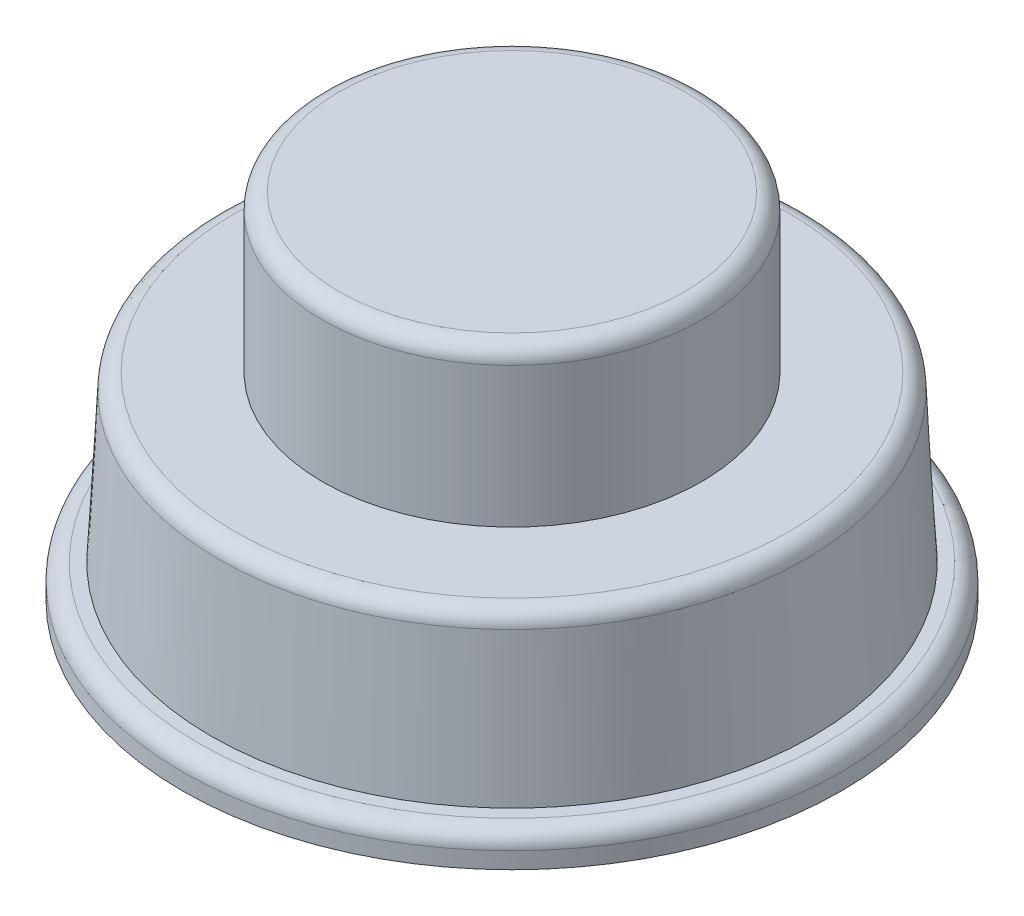
ISO-10303-21;
HEADER;
FILE_DESCRIPTION(('STEP AP214'),'2;1');
FILE_NAME('part.step','',(''),(''),'','','');
FILE_SCHEMA(('AUTOMOTIVE_DESIGN { 1 0 10303 214 1 1 1 1 }'));
ENDSEC;
DATA;
#1=APPLICATION_CONTEXT('core data for automotive mechanical design processes');
#2=APPLICATION_PROTOCOL_DEFINITION('international standard','automotive_design',2000,#1);
#3=PRODUCT_CONTEXT('',#1,'mechanical');
#4=PRODUCT('Part','Part','',(#3));
#5=PRODUCT_RELATED_PRODUCT_CATEGORY('part','',(#4));
#6=PRODUCT_DEFINITION_FORMATION('','',#4);
#7=PRODUCT_DEFINITION_CONTEXT('part definition',#1,'design');
#8=PRODUCT_DEFINITION('design','',#6,#7);
#9=PRODUCT_DEFINITION_SHAPE('','',#8);
#10=(LENGTH_UNIT() NAMED_UNIT(*) SI_UNIT(.MILLI.,.METRE.));
#11=(NAMED_UNIT(*) PLANE_ANGLE_UNIT() SI_UNIT($,.RADIAN.));
#12=(NAMED_UNIT(*) SI_UNIT($,.STERADIAN.) SOLID_ANGLE_UNIT());
#13=UNCERTAINTY_MEASURE_WITH_UNIT(LENGTH_MEASURE(1.E-05),#10,'distance_accuracy_value','');
#14=(GEOMETRIC_REPRESENTATION_CONTEXT(3) GLOBAL_UNCERTAINTY_ASSIGNED_CONTEXT((#13)) GLOBAL_UNIT_ASSIGNED_CONTEXT((#10,
#11,#12)) REPRESENTATION_CONTEXT('',''));
#15=CARTESIAN_POINT('',(0.,0.,0.));
#16=DIRECTION('',(0.,0.,1.));
#17=DIRECTION('',(1.,0.,0.));
#18=AXIS2_PLACEMENT_3D('',#15,#16,#17);
#19=CARTESIAN_POINT('',(0.,2.,0.));
#20=DIRECTION('',(0.,-1.,0.));
#21=DIRECTION('',(0.,0.,-1.));
#22=AXIS2_PLACEMENT_3D('',#19,#20,#21);
#23=CYLINDRICAL_SURFACE('',#22,20.);
#24=CARTESIAN_POINT('',(0.,1.,0.));
#25=DIRECTION('',(0.,1.,0.));
#26=DIRECTION('',(0.,0.,1.));
#27=AXIS2_PLACEMENT_3D('',#24,#25,#26);
#28=CIRCLE('',#27,20.);
#29=CARTESIAN_POINT('',(0.,1.,20.));
#30=VERTEX_POINT('',#29);
#31=EDGE_CURVE('E69',#30,#30,#28,.F.);
#32=ORIENTED_EDGE('',*,*,#31,.T.);
#33=EDGE_LOOP('',(#32));
#34=FACE_BOUND('',#33,.T.);
#35=CARTESIAN_POINT('',(0.,0.,0.));
#36=DIRECTION('',(0.,1.,0.));
#37=DIRECTION('',(0.,0.,1.));
#38=AXIS2_PLACEMENT_3D('',#35,#36,#37);
#39=CIRCLE('',#38,20.);
#40=CARTESIAN_POINT('',(0.,0.,20.));
#41=VERTEX_POINT('',#40);
#42=EDGE_CURVE('E78',#41,#41,#39,.T.);
#43=ORIENTED_EDGE('',*,*,#42,.T.);
#44=EDGE_LOOP('',(#43));
#45=FACE_BOUND('',#44,.T.);
#46=ADVANCED_FACE('F45',(#34,#45),#23,.T.);
#47=CARTESIAN_POINT('',(0.,2.,0.));
#48=DIRECTION('',(0.,1.,0.));
#49=DIRECTION('',(0.,0.,1.));
#50=AXIS2_PLACEMENT_3D('',#47,#48,#49);
#51=PLANE('',#50);
#52=CARTESIAN_POINT('',(0.,2.,0.));
#53=DIRECTION('',(0.,1.,0.));
#54=DIRECTION('',(0.,0.,1.));
#55=AXIS2_PLACEMENT_3D('',#52,#53,#54);
#56=CIRCLE('',#55,19.);
#57=CARTESIAN_POINT('',(0.,2.,19.));
#58=VERTEX_POINT('',#57);
#59=EDGE_CURVE('E73',#58,#58,#56,.T.);
#60=ORIENTED_EDGE('',*,*,#59,.T.);
#61=EDGE_LOOP('',(#60));
#62=FACE_BOUND('',#61,.T.);
#63=CARTESIAN_POINT('',(0.,2.,0.));
#64=DIRECTION('',(0.,1.,0.));
#65=DIRECTION('',(0.,0.,1.));
#66=AXIS2_PLACEMENT_3D('',#63,#64,#65);
#67=CIRCLE('',#66,18.25);
#68=CARTESIAN_POINT('',(0.,2.,18.25));
#69=VERTEX_POINT('',#68);
#70=EDGE_CURVE('E82',#69,#69,#67,.T.);
#71=ORIENTED_EDGE('',*,*,#70,.F.);
#72=EDGE_LOOP('',(#71));
#73=FACE_BOUND('',#72,.T.);
#74=ADVANCED_FACE('F108',(#62,#73),#51,.T.);
#75=CARTESIAN_POINT('',(0.,0.,0.));
#76=DIRECTION('',(0.,1.,0.));
#77=DIRECTION('',(0.,0.,1.));
#78=AXIS2_PLACEMENT_3D('',#75,#76,#77);
#79=PLANE('',#78);
#80=ORIENTED_EDGE('',*,*,#42,.F.);
#81=EDGE_LOOP('',(#80));
#82=FACE_BOUND('',#81,.T.);
#83=ADVANCED_FACE('F103',(#82),#79,.F.);
#84=CARTESIAN_POINT('',(0.,2.,0.));
#85=DIRECTION('',(0.,-1.,0.));
#86=DIRECTION('',(0.,0.,1.));
#87=AXIS2_PLACEMENT_3D('',#84,#85,#86);
#88=CONICAL_SURFACE('',#87,18.25,0.05235987755983);
#89=CARTESIAN_POINT('',(0.,11.0523359562429,0.));
#90=DIRECTION('',(0.,-1.,0.));
#91=DIRECTION('',(0.,0.,-1.));
#92=AXIS2_PLACEMENT_3D('',#89,#90,#91);
#93=CIRCLE('',#92,17.7755871752093);
#94=CARTESIAN_POINT('',(0.,11.0523359562429,-17.7755871752093));
#95=VERTEX_POINT('',#94);
#96=EDGE_CURVE('E58',#95,#95,#93,.T.);
#97=ORIENTED_EDGE('',*,*,#96,.T.);
#98=EDGE_LOOP('',(#97));
#99=FACE_BOUND('',#98,.T.);
#100=ORIENTED_EDGE('',*,*,#70,.T.);
#101=EDGE_LOOP('',(#100));
#102=FACE_BOUND('',#101,.T.);
#103=ADVANCED_FACE('F94',(#99,#102),#88,.T.);
#104=CARTESIAN_POINT('',(0.,12.,0.));
#105=DIRECTION('',(0.,1.,0.));
#106=DIRECTION('',(0.,0.,1.));
#107=AXIS2_PLACEMENT_3D('',#104,#105,#106);
#108=PLANE('',#107);
#109=CARTESIAN_POINT('',(0.,12.,0.));
#110=DIRECTION('',(0.,1.,0.));
#111=DIRECTION('',(0.,0.,1.));
#112=AXIS2_PLACEMENT_3D('',#109,#110,#111);
#113=CIRCLE('',#112,16.7769576404547);
#114=CARTESIAN_POINT('',(0.,12.,16.7769576404547));
#115=VERTEX_POINT('',#114);
#116=EDGE_CURVE('E63',#115,#115,#113,.T.);
#117=ORIENTED_EDGE('',*,*,#116,.T.);
#118=EDGE_LOOP('',(#117));
#119=FACE_BOUND('',#118,.T.);
#120=CARTESIAN_POINT('',(0.,12.,0.));
#121=DIRECTION('',(0.,1.,0.));
#122=DIRECTION('',(0.,0.,1.));
#123=AXIS2_PLACEMENT_3D('',#120,#121,#122);
#124=CIRCLE('',#123,11.5);
#125=CARTESIAN_POINT('',(0.,12.,11.5));
#126=VERTEX_POINT('',#125);
#127=EDGE_CURVE('E77',#126,#126,#124,.T.);
#128=ORIENTED_EDGE('',*,*,#127,.F.);
#129=EDGE_LOOP('',(#128));
#130=FACE_BOUND('',#129,.T.);
#131=ADVANCED_FACE('F92',(#119,#130),#108,.T.);
#132=CARTESIAN_POINT('',(0.,75.5269119345812,0.));
#133=DIRECTION('',(0.,-1.,0.));
#134=DIRECTION('',(0.,0.,-1.));
#135=AXIS2_PLACEMENT_3D('',#132,#133,#134);
#136=CYLINDRICAL_SURFACE('',#135,11.5);
#137=CARTESIAN_POINT('',(0.,20.5,0.));
#138=DIRECTION('',(0.,1.,0.));
#139=DIRECTION('',(0.,0.,1.));
#140=AXIS2_PLACEMENT_3D('',#137,#138,#139);
#141=CIRCLE('',#140,11.5);
#142=CARTESIAN_POINT('',(0.,20.5,11.5));
#143=VERTEX_POINT('',#142);
#144=EDGE_CURVE('E11',#143,#143,#141,.F.);
#145=ORIENTED_EDGE('',*,*,#144,.T.);
#146=EDGE_LOOP('',(#145));
#147=FACE_BOUND('',#146,.T.);
#148=ORIENTED_EDGE('',*,*,#127,.T.);
#149=EDGE_LOOP('',(#148));
#150=FACE_BOUND('',#149,.T.);
#151=ADVANCED_FACE('F90',(#147,#150),#136,.T.);
#152=CARTESIAN_POINT('',(0.,21.5,0.));
#153=DIRECTION('',(0.,1.,0.));
#154=DIRECTION('',(0.,0.,1.));
#155=AXIS2_PLACEMENT_3D('',#152,#153,#154);
#156=PLANE('',#155);
#157=CARTESIAN_POINT('',(0.,21.5,0.));
#158=DIRECTION('',(0.,1.,0.));
#159=DIRECTION('',(0.,0.,1.));
#160=AXIS2_PLACEMENT_3D('',#157,#158,#159);
#161=CIRCLE('',#160,10.5);
#162=CARTESIAN_POINT('',(0.,21.5,10.5));
#163=VERTEX_POINT('',#162);
#164=EDGE_CURVE('E53',#163,#163,#161,.T.);
#165=ORIENTED_EDGE('',*,*,#164,.T.);
#166=EDGE_LOOP('',(#165));
#167=FACE_BOUND('',#166,.T.);
#168=ADVANCED_FACE('F101',(#167),#156,.T.);
#169=CARTESIAN_POINT('',(0.,1.,0.));
#170=DIRECTION('',(0.,1.,0.));
#171=DIRECTION('',(0.,0.,1.));
#172=AXIS2_PLACEMENT_3D('',#169,#170,#171);
#173=TOROIDAL_SURFACE('',#172,19.,1.);
#174=ORIENTED_EDGE('',*,*,#31,.F.);
#175=EDGE_LOOP('',(#174));
#176=FACE_BOUND('',#175,.T.);
#177=ORIENTED_EDGE('',*,*,#59,.F.);
#178=EDGE_LOOP('',(#177));
#179=FACE_BOUND('',#178,.T.);
#180=ADVANCED_FACE('F120',(#176,#179),#173,.T.);
#181=CARTESIAN_POINT('',(0.,11.,0.));
#182=DIRECTION('',(0.,1.,0.));
#183=DIRECTION('',(0.,0.,1.));
#184=AXIS2_PLACEMENT_3D('',#181,#182,#183);
#185=TOROIDAL_SURFACE('',#184,16.7769576404547,1.);
#186=ORIENTED_EDGE('',*,*,#96,.F.);
#187=EDGE_LOOP('',(#186));
#188=FACE_BOUND('',#187,.T.);
#189=ORIENTED_EDGE('',*,*,#116,.F.);
#190=EDGE_LOOP('',(#189));
#191=FACE_BOUND('',#190,.T.);
#192=ADVANCED_FACE('F122',(#188,#191),#185,.T.);
#193=CARTESIAN_POINT('',(0.,20.5,0.));
#194=DIRECTION('',(0.,1.,0.));
#195=DIRECTION('',(0.,0.,1.));
#196=AXIS2_PLACEMENT_3D('',#193,#194,#195);
#197=TOROIDAL_SURFACE('',#196,10.5,1.);
#198=ORIENTED_EDGE('',*,*,#144,.F.);
#199=EDGE_LOOP('',(#198));
#200=FACE_BOUND('',#199,.T.);
#201=ORIENTED_EDGE('',*,*,#164,.F.);
#202=EDGE_LOOP('',(#201));
#203=FACE_BOUND('',#202,.T.);
#204=ADVANCED_FACE('F47',(#200,#203),#197,.T.);
#205=CLOSED_SHELL('',(#46,#74,#83,#103,#131,#151,#168,#180,#192,#204));
#206=MANIFOLD_SOLID_BREP('B2',#205);
#207=ADVANCED_BREP_SHAPE_REPRESENTATION('',(#18,#206),#14);
#208=SHAPE_DEFINITION_REPRESENTATION(#9,#207);
ENDSEC;
END-ISO-10303-21;
